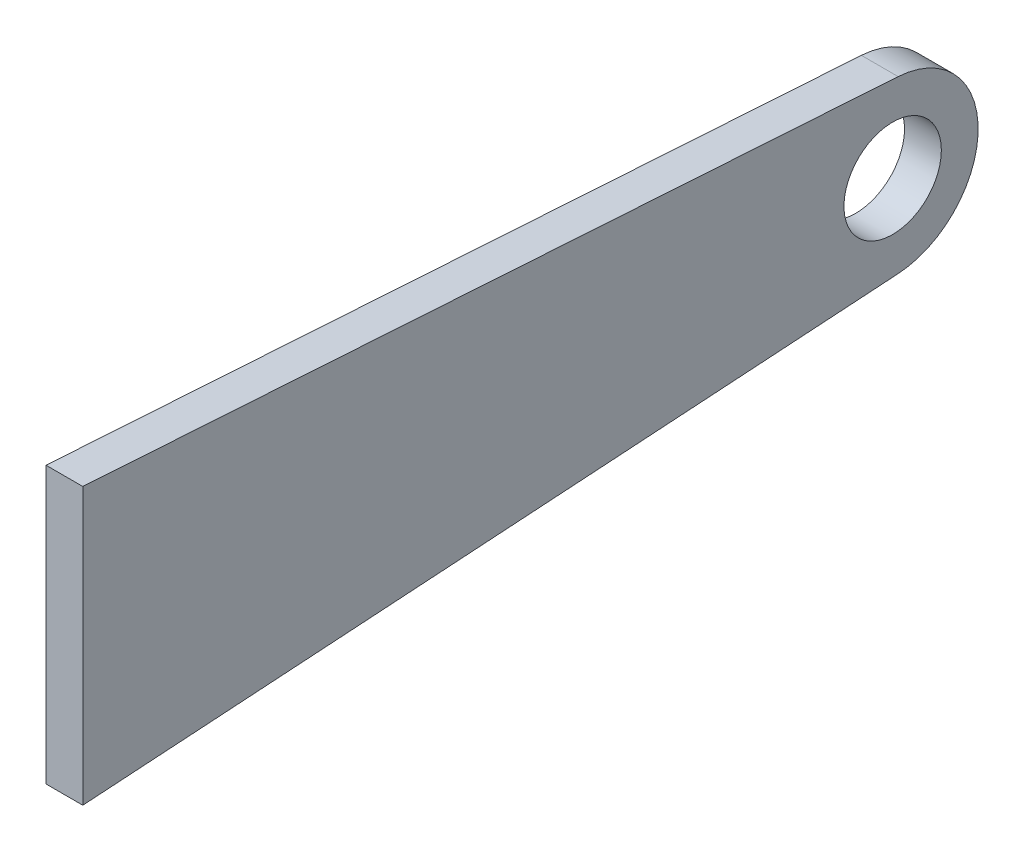
ISO-10303-21;
HEADER;
FILE_DESCRIPTION(('STEP AP214'),'2;1');
FILE_NAME('part.step','',(''),(''),'','','');
FILE_SCHEMA(('AUTOMOTIVE_DESIGN { 1 0 10303 214 1 1 1 1 }'));
ENDSEC;
DATA;
#1=APPLICATION_CONTEXT('core data for automotive mechanical design processes');
#2=APPLICATION_PROTOCOL_DEFINITION('international standard','automotive_design',2000,#1);
#3=PRODUCT_CONTEXT('',#1,'mechanical');
#4=PRODUCT('Part','Part','',(#3));
#5=PRODUCT_RELATED_PRODUCT_CATEGORY('part','',(#4));
#6=PRODUCT_DEFINITION_FORMATION('','',#4);
#7=PRODUCT_DEFINITION_CONTEXT('part definition',#1,'design');
#8=PRODUCT_DEFINITION('design','',#6,#7);
#9=PRODUCT_DEFINITION_SHAPE('','',#8);
#10=(LENGTH_UNIT() NAMED_UNIT(*) SI_UNIT(.MILLI.,.METRE.));
#11=(NAMED_UNIT(*) PLANE_ANGLE_UNIT() SI_UNIT($,.RADIAN.));
#12=(NAMED_UNIT(*) SI_UNIT($,.STERADIAN.) SOLID_ANGLE_UNIT());
#13=UNCERTAINTY_MEASURE_WITH_UNIT(LENGTH_MEASURE(1.E-05),#10,'distance_accuracy_value','');
#14=(GEOMETRIC_REPRESENTATION_CONTEXT(3) GLOBAL_UNCERTAINTY_ASSIGNED_CONTEXT((#13)) GLOBAL_UNIT_ASSIGNED_CONTEXT((#10,
#11,#12)) REPRESENTATION_CONTEXT('',''));
#15=CARTESIAN_POINT('',(0.,0.,0.));
#16=DIRECTION('',(0.,0.,1.));
#17=DIRECTION('',(1.,0.,0.));
#18=AXIS2_PLACEMENT_3D('',#15,#16,#17);
#19=CARTESIAN_POINT('',(1.5875,0.,0.));
#20=DIRECTION('',(1.,0.,0.));
#21=DIRECTION('',(0.,0.,-1.));
#22=AXIS2_PLACEMENT_3D('',#19,#20,#21);
#23=PLANE('',#22);
#24=DIRECTION('',(0.,0.0645160394348533,0.997916670196284));
#25=VECTOR('',#24,1.);
#26=CARTESIAN_POINT('',(1.5875,7.3596354426976,-0.475805790832043));
#27=LINE('',#26,#25);
#28=CARTESIAN_POINT('',(1.5875,7.3596354426976,-0.47580579083204));
#29=VERTEX_POINT('',#28);
#30=CARTESIAN_POINT('',(1.5875,11.90625,69.85));
#31=VERTEX_POINT('',#30);
#32=EDGE_CURVE('E87',#29,#31,#27,.T.);
#33=ORIENTED_EDGE('',*,*,#32,.T.);
#34=DIRECTION('',(0.,-1.,0.));
#35=VECTOR('',#34,1.);
#36=CARTESIAN_POINT('',(1.5875,11.90625,69.85));
#37=LINE('',#36,#35);
#38=CARTESIAN_POINT('',(1.5875,-11.90625,69.85));
#39=VERTEX_POINT('',#38);
#40=EDGE_CURVE('E82',#31,#39,#37,.T.);
#41=ORIENTED_EDGE('',*,*,#40,.T.);
#42=DIRECTION('',(0.,0.0645160394348536,-0.997916670196285));
#43=VECTOR('',#42,1.);
#44=CARTESIAN_POINT('',(1.5875,-7.3596354426976,-0.475805790832045));
#45=LINE('',#44,#43);
#46=CARTESIAN_POINT('',(1.5875,-7.3596354426976,-0.475805790832045));
#47=VERTEX_POINT('',#46);
#48=EDGE_CURVE('E85',#39,#47,#45,.T.);
#49=ORIENTED_EDGE('',*,*,#48,.T.);
#50=CARTESIAN_POINT('',(1.5875,0.,0.));
#51=DIRECTION('',(1.,0.,0.));
#52=DIRECTION('',(0.,0.,-1.));
#53=AXIS2_PLACEMENT_3D('',#50,#51,#52);
#54=CIRCLE('',#53,7.375);
#55=EDGE_CURVE('E52',#47,#29,#54,.T.);
#56=ORIENTED_EDGE('',*,*,#55,.T.);
#57=EDGE_LOOP('',(#33,#41,#49,#56));
#58=FACE_BOUND('',#57,.T.);
#59=CARTESIAN_POINT('',(1.5875,0.,0.));
#60=DIRECTION('',(1.,0.,0.));
#61=DIRECTION('',(0.,0.,-1.));
#62=AXIS2_PLACEMENT_3D('',#59,#60,#61);
#63=CIRCLE('',#62,4.2);
#64=CARTESIAN_POINT('',(1.5875,0.,-4.2));
#65=VERTEX_POINT('',#64);
#66=EDGE_CURVE('E102',#65,#65,#63,.T.);
#67=ORIENTED_EDGE('',*,*,#66,.F.);
#68=EDGE_LOOP('',(#67));
#69=FACE_BOUND('',#68,.T.);
#70=ADVANCED_FACE('F35',(#58,#69),#23,.T.);
#71=CARTESIAN_POINT('',(-1.5875,0.,0.));
#72=DIRECTION('',(1.,0.,0.));
#73=DIRECTION('',(0.,0.,-1.));
#74=AXIS2_PLACEMENT_3D('',#71,#72,#73);
#75=PLANE('',#74);
#76=DIRECTION('',(0.,0.0645160394348533,0.997916670196284));
#77=VECTOR('',#76,1.);
#78=CARTESIAN_POINT('',(-1.5875,7.3596354426976,-0.475805790832043));
#79=LINE('',#78,#77);
#80=CARTESIAN_POINT('',(-1.5875,7.3596354426976,-0.47580579083204));
#81=VERTEX_POINT('',#80);
#82=CARTESIAN_POINT('',(-1.5875,11.90625,69.85));
#83=VERTEX_POINT('',#82);
#84=EDGE_CURVE('E99',#81,#83,#79,.T.);
#85=ORIENTED_EDGE('',*,*,#84,.F.);
#86=CARTESIAN_POINT('',(-1.5875,0.,0.));
#87=DIRECTION('',(1.,0.,0.));
#88=DIRECTION('',(0.,0.,-1.));
#89=AXIS2_PLACEMENT_3D('',#86,#87,#88);
#90=CIRCLE('',#89,7.375);
#91=CARTESIAN_POINT('',(-1.5875,-7.3596354426976,-0.475805790832045));
#92=VERTEX_POINT('',#91);
#93=EDGE_CURVE('E75',#92,#81,#90,.T.);
#94=ORIENTED_EDGE('',*,*,#93,.F.);
#95=DIRECTION('',(0.,0.0645160394348536,-0.997916670196285));
#96=VECTOR('',#95,1.);
#97=CARTESIAN_POINT('',(-1.5875,-7.3596354426976,-0.475805790832045));
#98=LINE('',#97,#96);
#99=CARTESIAN_POINT('',(-1.5875,-11.90625,69.85));
#100=VERTEX_POINT('',#99);
#101=EDGE_CURVE('E69',#100,#92,#98,.T.);
#102=ORIENTED_EDGE('',*,*,#101,.F.);
#103=DIRECTION('',(0.,-1.,0.));
#104=VECTOR('',#103,1.);
#105=CARTESIAN_POINT('',(-1.5875,11.90625,69.85));
#106=LINE('',#105,#104);
#107=EDGE_CURVE('E91',#83,#100,#106,.T.);
#108=ORIENTED_EDGE('',*,*,#107,.F.);
#109=EDGE_LOOP('',(#85,#94,#102,#108));
#110=FACE_BOUND('',#109,.T.);
#111=CARTESIAN_POINT('',(-1.5875,0.,0.));
#112=DIRECTION('',(1.,0.,0.));
#113=DIRECTION('',(0.,0.,-1.));
#114=AXIS2_PLACEMENT_3D('',#111,#112,#113);
#115=CIRCLE('',#114,4.2);
#116=CARTESIAN_POINT('',(-1.5875,0.,-4.2));
#117=VERTEX_POINT('',#116);
#118=EDGE_CURVE('E114',#117,#117,#115,.T.);
#119=ORIENTED_EDGE('',*,*,#118,.T.);
#120=EDGE_LOOP('',(#119));
#121=FACE_BOUND('',#120,.T.);
#122=ADVANCED_FACE('F110',(#110,#121),#75,.F.);
#123=CARTESIAN_POINT('',(1.5875,7.3596354426976,-0.475805790832043));
#124=DIRECTION('',(0.,-0.997916670196285,0.0645160394348534));
#125=DIRECTION('',(0.,-0.0645160394348534,-0.997916670196285));
#126=AXIS2_PLACEMENT_3D('',#123,#124,#125);
#127=PLANE('',#126);
#128=ORIENTED_EDGE('',*,*,#84,.T.);
#129=DIRECTION('',(-1.,0.,0.));
#130=VECTOR('',#129,1.);
#131=CARTESIAN_POINT('',(1.5875,11.90625,69.85));
#132=LINE('',#131,#130);
#133=EDGE_CURVE('E11',#31,#83,#132,.T.);
#134=ORIENTED_EDGE('',*,*,#133,.F.);
#135=ORIENTED_EDGE('',*,*,#32,.F.);
#136=DIRECTION('',(-1.,0.,0.));
#137=VECTOR('',#136,1.);
#138=CARTESIAN_POINT('',(1.5875,7.3596354426976,-0.47580579083204));
#139=LINE('',#138,#137);
#140=EDGE_CURVE('E95',#29,#81,#139,.T.);
#141=ORIENTED_EDGE('',*,*,#140,.T.);
#142=EDGE_LOOP('',(#128,#134,#135,#141));
#143=FACE_BOUND('',#142,.T.);
#144=ADVANCED_FACE('F37',(#143),#127,.F.);
#145=CARTESIAN_POINT('',(1.5875,11.90625,69.85));
#146=DIRECTION('',(0.,0.,-1.));
#147=DIRECTION('',(0.,1.,0.));
#148=AXIS2_PLACEMENT_3D('',#145,#146,#147);
#149=PLANE('',#148);
#150=ORIENTED_EDGE('',*,*,#107,.T.);
#151=DIRECTION('',(-1.,0.,0.));
#152=VECTOR('',#151,1.);
#153=CARTESIAN_POINT('',(1.5875,-11.90625,69.85));
#154=LINE('',#153,#152);
#155=EDGE_CURVE('E44',#39,#100,#154,.T.);
#156=ORIENTED_EDGE('',*,*,#155,.F.);
#157=ORIENTED_EDGE('',*,*,#40,.F.);
#158=ORIENTED_EDGE('',*,*,#133,.T.);
#159=EDGE_LOOP('',(#150,#156,#157,#158));
#160=FACE_BOUND('',#159,.T.);
#161=ADVANCED_FACE('F90',(#160),#149,.F.);
#162=CARTESIAN_POINT('',(1.5875,-7.3596354426976,-0.475805790832045));
#163=DIRECTION('',(0.,0.997916670196285,0.0645160394348535));
#164=DIRECTION('',(0.,-0.0645160394348536,0.997916670196285));
#165=AXIS2_PLACEMENT_3D('',#162,#163,#164);
#166=PLANE('',#165);
#167=ORIENTED_EDGE('',*,*,#101,.T.);
#168=DIRECTION('',(-1.,0.,0.));
#169=VECTOR('',#168,1.);
#170=CARTESIAN_POINT('',(1.5875,-7.3596354426976,-0.475805790832045));
#171=LINE('',#170,#169);
#172=EDGE_CURVE('E92',#47,#92,#171,.T.);
#173=ORIENTED_EDGE('',*,*,#172,.F.);
#174=ORIENTED_EDGE('',*,*,#48,.F.);
#175=ORIENTED_EDGE('',*,*,#155,.T.);
#176=EDGE_LOOP('',(#167,#173,#174,#175));
#177=FACE_BOUND('',#176,.T.);
#178=ADVANCED_FACE('F93',(#177),#166,.F.);
#179=CARTESIAN_POINT('',(1.5875,0.,0.));
#180=DIRECTION('',(-1.,0.,0.));
#181=DIRECTION('',(0.,0.,1.));
#182=AXIS2_PLACEMENT_3D('',#179,#180,#181);
#183=CYLINDRICAL_SURFACE('',#182,7.375);
#184=ORIENTED_EDGE('',*,*,#93,.T.);
#185=ORIENTED_EDGE('',*,*,#140,.F.);
#186=ORIENTED_EDGE('',*,*,#55,.F.);
#187=ORIENTED_EDGE('',*,*,#172,.T.);
#188=EDGE_LOOP('',(#184,#185,#186,#187));
#189=FACE_BOUND('',#188,.T.);
#190=ADVANCED_FACE('F107',(#189),#183,.T.);
#191=CARTESIAN_POINT('',(1.5875,0.,0.));
#192=DIRECTION('',(-1.,0.,0.));
#193=DIRECTION('',(0.,0.,1.));
#194=AXIS2_PLACEMENT_3D('',#191,#192,#193);
#195=CYLINDRICAL_SURFACE('',#194,4.2);
#196=ORIENTED_EDGE('',*,*,#66,.T.);
#197=EDGE_LOOP('',(#196));
#198=FACE_BOUND('',#197,.T.);
#199=ORIENTED_EDGE('',*,*,#118,.F.);
#200=EDGE_LOOP('',(#199));
#201=FACE_BOUND('',#200,.T.);
#202=ADVANCED_FACE('F120',(#198,#201),#195,.F.);
#203=CLOSED_SHELL('',(#70,#122,#144,#161,#178,#190,#202));
#204=MANIFOLD_SOLID_BREP('B2',#203);
#205=ADVANCED_BREP_SHAPE_REPRESENTATION('',(#18,#204),#14);
#206=SHAPE_DEFINITION_REPRESENTATION(#9,#205);
ENDSEC;
END-ISO-10303-21;
